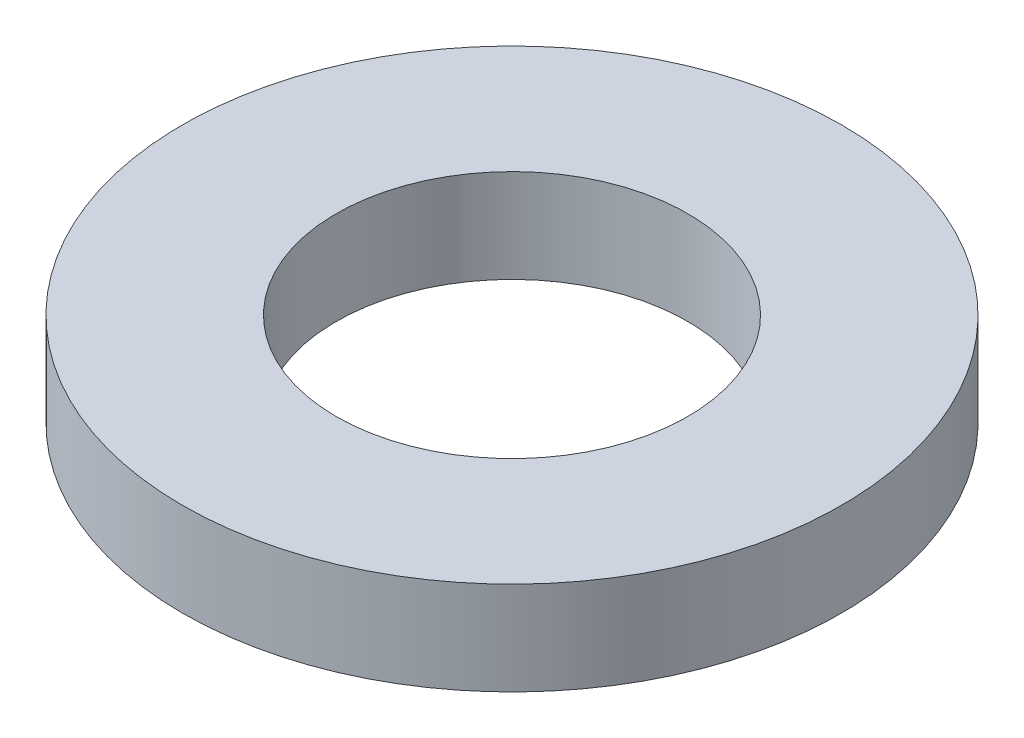
ISO-10303-21;
HEADER;
FILE_DESCRIPTION(('STEP AP214'),'2;1');
FILE_NAME('part.step','',(''),(''),'','','');
FILE_SCHEMA(('AUTOMOTIVE_DESIGN { 1 0 10303 214 1 1 1 1 }'));
ENDSEC;
DATA;
#1=APPLICATION_CONTEXT('core data for automotive mechanical design processes');
#2=APPLICATION_PROTOCOL_DEFINITION('international standard','automotive_design',2000,#1);
#3=PRODUCT_CONTEXT('',#1,'mechanical');
#4=PRODUCT('Part','Part','',(#3));
#5=PRODUCT_RELATED_PRODUCT_CATEGORY('part','',(#4));
#6=PRODUCT_DEFINITION_FORMATION('','',#4);
#7=PRODUCT_DEFINITION_CONTEXT('part definition',#1,'design');
#8=PRODUCT_DEFINITION('design','',#6,#7);
#9=PRODUCT_DEFINITION_SHAPE('','',#8);
#10=(LENGTH_UNIT() NAMED_UNIT(*) SI_UNIT(.MILLI.,.METRE.));
#11=(NAMED_UNIT(*) PLANE_ANGLE_UNIT() SI_UNIT($,.RADIAN.));
#12=(NAMED_UNIT(*) SI_UNIT($,.STERADIAN.) SOLID_ANGLE_UNIT());
#13=UNCERTAINTY_MEASURE_WITH_UNIT(LENGTH_MEASURE(1.E-05),#10,'distance_accuracy_value','');
#14=(GEOMETRIC_REPRESENTATION_CONTEXT(3) GLOBAL_UNCERTAINTY_ASSIGNED_CONTEXT((#13)) GLOBAL_UNIT_ASSIGNED_CONTEXT((#10,
#11,#12)) REPRESENTATION_CONTEXT('',''));
#15=CARTESIAN_POINT('',(0.,0.,0.));
#16=DIRECTION('',(0.,0.,1.));
#17=DIRECTION('',(1.,0.,0.));
#18=AXIS2_PLACEMENT_3D('',#15,#16,#17);
#19=CARTESIAN_POINT('',(0.,1.7,0.));
#20=DIRECTION('',(0.,1.,0.));
#21=DIRECTION('',(0.,0.,1.));
#22=AXIS2_PLACEMENT_3D('',#19,#20,#21);
#23=PLANE('',#22);
#24=CARTESIAN_POINT('',(0.,1.7,0.));
#25=DIRECTION('',(0.,1.,0.));
#26=DIRECTION('',(0.,0.,1.));
#27=AXIS2_PLACEMENT_3D('',#24,#25,#26);
#28=CIRCLE('',#27,6.);
#29=CARTESIAN_POINT('',(0.,1.7,6.));
#30=VERTEX_POINT('',#29);
#31=EDGE_CURVE('E10',#30,#30,#28,.T.);
#32=ORIENTED_EDGE('',*,*,#31,.T.);
#33=EDGE_LOOP('',(#32));
#34=FACE_BOUND('',#33,.T.);
#35=CARTESIAN_POINT('',(0.,1.7,0.));
#36=DIRECTION('',(0.,1.,0.));
#37=DIRECTION('',(0.,0.,1.));
#38=AXIS2_PLACEMENT_3D('',#35,#36,#37);
#39=CIRCLE('',#38,3.2);
#40=CARTESIAN_POINT('',(0.,1.7,3.2));
#41=VERTEX_POINT('',#40);
#42=EDGE_CURVE('E44',#41,#41,#39,.T.);
#43=ORIENTED_EDGE('',*,*,#42,.F.);
#44=EDGE_LOOP('',(#43));
#45=FACE_BOUND('',#44,.T.);
#46=ADVANCED_FACE('F33',(#34,#45),#23,.T.);
#47=CARTESIAN_POINT('',(0.,0.,0.));
#48=DIRECTION('',(0.,1.,0.));
#49=DIRECTION('',(0.,0.,1.));
#50=AXIS2_PLACEMENT_3D('',#47,#48,#49);
#51=PLANE('',#50);
#52=CARTESIAN_POINT('',(0.,0.,0.));
#53=DIRECTION('',(0.,1.,0.));
#54=DIRECTION('',(0.,0.,1.));
#55=AXIS2_PLACEMENT_3D('',#52,#53,#54);
#56=CIRCLE('',#55,6.);
#57=CARTESIAN_POINT('',(0.,0.,6.));
#58=VERTEX_POINT('',#57);
#59=EDGE_CURVE('E37',#58,#58,#56,.T.);
#60=ORIENTED_EDGE('',*,*,#59,.F.);
#61=EDGE_LOOP('',(#60));
#62=FACE_BOUND('',#61,.T.);
#63=CARTESIAN_POINT('',(0.,0.,0.));
#64=DIRECTION('',(0.,1.,0.));
#65=DIRECTION('',(0.,0.,1.));
#66=AXIS2_PLACEMENT_3D('',#63,#64,#65);
#67=CIRCLE('',#66,3.2);
#68=CARTESIAN_POINT('',(0.,0.,3.2));
#69=VERTEX_POINT('',#68);
#70=EDGE_CURVE('E46',#69,#69,#67,.T.);
#71=ORIENTED_EDGE('',*,*,#70,.T.);
#72=EDGE_LOOP('',(#71));
#73=FACE_BOUND('',#72,.T.);
#74=ADVANCED_FACE('F56',(#62,#73),#51,.F.);
#75=CARTESIAN_POINT('',(0.,1.7,0.));
#76=DIRECTION('',(0.,-1.,0.));
#77=DIRECTION('',(0.,0.,-1.));
#78=AXIS2_PLACEMENT_3D('',#75,#76,#77);
#79=CYLINDRICAL_SURFACE('',#78,6.);
#80=ORIENTED_EDGE('',*,*,#31,.F.);
#81=EDGE_LOOP('',(#80));
#82=FACE_BOUND('',#81,.T.);
#83=ORIENTED_EDGE('',*,*,#59,.T.);
#84=EDGE_LOOP('',(#83));
#85=FACE_BOUND('',#84,.T.);
#86=ADVANCED_FACE('F35',(#82,#85),#79,.T.);
#87=CARTESIAN_POINT('',(0.,1.7,0.));
#88=DIRECTION('',(0.,-1.,0.));
#89=DIRECTION('',(0.,0.,-1.));
#90=AXIS2_PLACEMENT_3D('',#87,#88,#89);
#91=CYLINDRICAL_SURFACE('',#90,3.2);
#92=ORIENTED_EDGE('',*,*,#42,.T.);
#93=EDGE_LOOP('',(#92));
#94=FACE_BOUND('',#93,.T.);
#95=ORIENTED_EDGE('',*,*,#70,.F.);
#96=EDGE_LOOP('',(#95));
#97=FACE_BOUND('',#96,.T.);
#98=ADVANCED_FACE('F52',(#94,#97),#91,.F.);
#99=CLOSED_SHELL('',(#46,#74,#86,#98));
#100=MANIFOLD_SOLID_BREP('B2',#99);
#101=ADVANCED_BREP_SHAPE_REPRESENTATION('',(#18,#100),#14);
#102=SHAPE_DEFINITION_REPRESENTATION(#9,#101);
ENDSEC;
END-ISO-10303-21;
